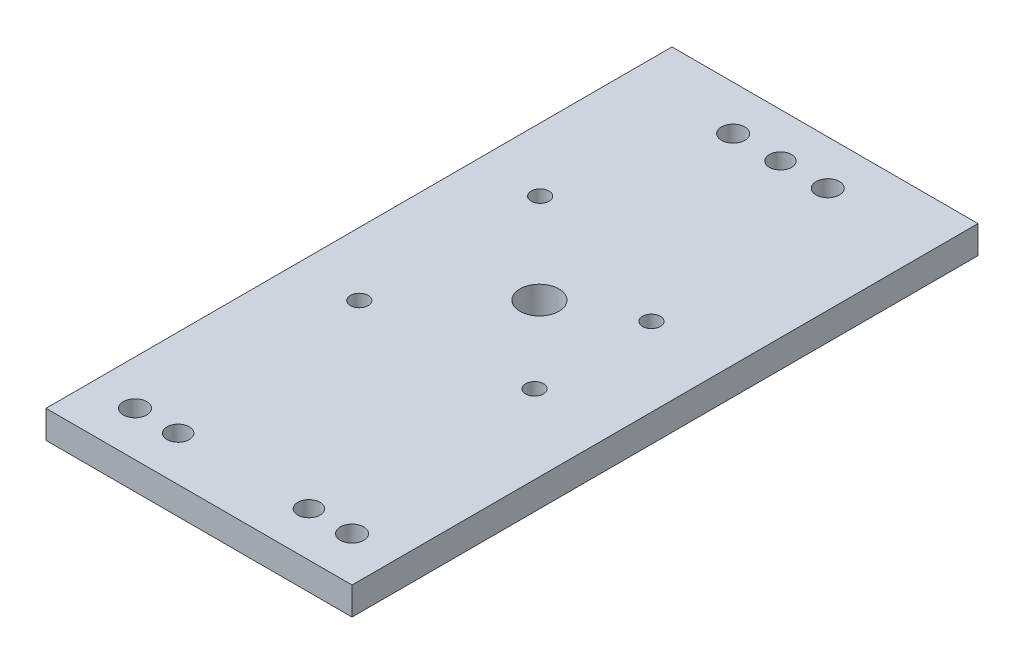
ISO-10303-21;
HEADER;
FILE_DESCRIPTION(('STEP AP214'),'2;1');
FILE_NAME('part.step','',(''),(''),'','','');
FILE_SCHEMA(('AUTOMOTIVE_DESIGN { 1 0 10303 214 1 1 1 1 }'));
ENDSEC;
DATA;
#1=APPLICATION_CONTEXT('core data for automotive mechanical design processes');
#2=APPLICATION_PROTOCOL_DEFINITION('international standard','automotive_design',2000,#1);
#3=PRODUCT_CONTEXT('',#1,'mechanical');
#4=PRODUCT('Part','Part','',(#3));
#5=PRODUCT_RELATED_PRODUCT_CATEGORY('part','',(#4));
#6=PRODUCT_DEFINITION_FORMATION('','',#4);
#7=PRODUCT_DEFINITION_CONTEXT('part definition',#1,'design');
#8=PRODUCT_DEFINITION('design','',#6,#7);
#9=PRODUCT_DEFINITION_SHAPE('','',#8);
#10=(LENGTH_UNIT() NAMED_UNIT(*) SI_UNIT(.MILLI.,.METRE.));
#11=(NAMED_UNIT(*) PLANE_ANGLE_UNIT() SI_UNIT($,.RADIAN.));
#12=(NAMED_UNIT(*) SI_UNIT($,.STERADIAN.) SOLID_ANGLE_UNIT());
#13=UNCERTAINTY_MEASURE_WITH_UNIT(LENGTH_MEASURE(1.E-05),#10,'distance_accuracy_value','');
#14=(GEOMETRIC_REPRESENTATION_CONTEXT(3) GLOBAL_UNCERTAINTY_ASSIGNED_CONTEXT((#13)) GLOBAL_UNIT_ASSIGNED_CONTEXT((#10,
#11,#12)) REPRESENTATION_CONTEXT('',''));
#15=CARTESIAN_POINT('',(0.,0.,0.));
#16=DIRECTION('',(0.,0.,1.));
#17=DIRECTION('',(1.,0.,0.));
#18=AXIS2_PLACEMENT_3D('',#15,#16,#17);
#19=CARTESIAN_POINT('',(0.,0.,0.));
#20=DIRECTION('',(0.,-1.,0.));
#21=DIRECTION('',(0.,0.,-1.));
#22=AXIS2_PLACEMENT_3D('',#19,#20,#21);
#23=PLANE('',#22);
#24=CARTESIAN_POINT('',(26.7499999999997,0.,-23.3599999999999));
#25=DIRECTION('',(0.,1.,0.));
#26=DIRECTION('',(0.,0.,1.));
#27=AXIS2_PLACEMENT_3D('',#24,#25,#26);
#28=CIRCLE('',#27,3.2);
#29=CARTESIAN_POINT('',(26.7499999999997,0.,-20.1599999999999));
#30=VERTEX_POINT('',#29);
#31=EDGE_CURVE('E192',#30,#30,#28,.T.);
#32=ORIENTED_EDGE('',*,*,#31,.F.);
#33=EDGE_LOOP('',(#32));
#34=FACE_BOUND('',#33,.T.);
#35=CARTESIAN_POINT('',(-32.2500000000002,0.,-42.3599999999969));
#36=DIRECTION('',(0.,1.,0.));
#37=DIRECTION('',(0.,0.,1.));
#38=AXIS2_PLACEMENT_3D('',#35,#36,#37);
#39=CIRCLE('',#38,3.2);
#40=CARTESIAN_POINT('',(-32.2500000000002,0.,-39.1599999999969));
#41=VERTEX_POINT('',#40);
#42=EDGE_CURVE('E202',#41,#41,#39,.T.);
#43=ORIENTED_EDGE('',*,*,#42,.F.);
#44=EDGE_LOOP('',(#43));
#45=FACE_BOUND('',#44,.T.);
#46=CARTESIAN_POINT('',(-32.2500000000002,0.,22.6400000000031));
#47=DIRECTION('',(0.,1.,0.));
#48=DIRECTION('',(0.,0.,1.));
#49=AXIS2_PLACEMENT_3D('',#46,#47,#48);
#50=CIRCLE('',#49,3.2);
#51=CARTESIAN_POINT('',(-32.2500000000002,0.,25.8400000000031));
#52=VERTEX_POINT('',#51);
#53=EDGE_CURVE('E208',#52,#52,#50,.T.);
#54=ORIENTED_EDGE('',*,*,#53,.F.);
#55=EDGE_LOOP('',(#54));
#56=FACE_BOUND('',#55,.T.);
#57=CARTESIAN_POINT('',(-1.11022302462516E-13,0.,-9.85999999999726));
#58=DIRECTION('',(0.,1.,0.));
#59=DIRECTION('',(0.,0.,1.));
#60=AXIS2_PLACEMENT_3D('',#57,#58,#59);
#61=CIRCLE('',#60,7.);
#62=CARTESIAN_POINT('',(-1.11022302462516E-13,0.,-2.85999999999726));
#63=VERTEX_POINT('',#62);
#64=EDGE_CURVE('E215',#63,#63,#61,.T.);
#65=ORIENTED_EDGE('',*,*,#64,.F.);
#66=EDGE_LOOP('',(#65));
#67=FACE_BOUND('',#66,.T.);
#68=CARTESIAN_POINT('',(0.,0.,-96.5));
#69=DIRECTION('',(0.,1.,0.));
#70=DIRECTION('',(0.,0.,1.));
#71=AXIS2_PLACEMENT_3D('',#68,#69,#70);
#72=CIRCLE('',#71,4.);
#73=CARTESIAN_POINT('',(0.,0.,-92.5));
#74=VERTEX_POINT('',#73);
#75=EDGE_CURVE('E218',#74,#74,#72,.T.);
#76=ORIENTED_EDGE('',*,*,#75,.F.);
#77=EDGE_LOOP('',(#76));
#78=FACE_BOUND('',#77,.T.);
#79=CARTESIAN_POINT('',(-23.5000000000001,0.,96.5));
#80=DIRECTION('',(0.,1.,0.));
#81=DIRECTION('',(0.,0.,1.));
#82=AXIS2_PLACEMENT_3D('',#79,#80,#81);
#83=CIRCLE('',#82,4.);
#84=CARTESIAN_POINT('',(-23.5000000000001,0.,100.5));
#85=VERTEX_POINT('',#84);
#86=EDGE_CURVE('E226',#85,#85,#83,.T.);
#87=ORIENTED_EDGE('',*,*,#86,.F.);
#88=EDGE_LOOP('',(#87));
#89=FACE_BOUND('',#88,.T.);
#90=CARTESIAN_POINT('',(23.4999999999999,0.,96.5));
#91=DIRECTION('',(0.,1.,0.));
#92=DIRECTION('',(0.,0.,1.));
#93=AXIS2_PLACEMENT_3D('',#90,#91,#92);
#94=CIRCLE('',#93,4.);
#95=CARTESIAN_POINT('',(23.4999999999999,0.,100.5));
#96=VERTEX_POINT('',#95);
#97=EDGE_CURVE('E232',#96,#96,#94,.T.);
#98=ORIENTED_EDGE('',*,*,#97,.F.);
#99=EDGE_LOOP('',(#98));
#100=FACE_BOUND('',#99,.T.);
#101=CARTESIAN_POINT('',(-17.0000000000001,0.,-96.5));
#102=DIRECTION('',(0.,1.,0.));
#103=DIRECTION('',(0.,0.,1.));
#104=AXIS2_PLACEMENT_3D('',#101,#102,#103);
#105=CIRCLE('',#104,4.2);
#106=CARTESIAN_POINT('',(-17.0000000000001,0.,-92.3));
#107=VERTEX_POINT('',#106);
#108=EDGE_CURVE('E238',#107,#107,#105,.T.);
#109=ORIENTED_EDGE('',*,*,#108,.F.);
#110=EDGE_LOOP('',(#109));
#111=FACE_BOUND('',#110,.T.);
#112=CARTESIAN_POINT('',(16.9999999999999,0.,-96.5));
#113=DIRECTION('',(0.,1.,0.));
#114=DIRECTION('',(0.,0.,1.));
#115=AXIS2_PLACEMENT_3D('',#112,#113,#114);
#116=CIRCLE('',#115,4.2);
#117=CARTESIAN_POINT('',(16.9999999999999,0.,-92.3));
#118=VERTEX_POINT('',#117);
#119=EDGE_CURVE('E244',#118,#118,#116,.T.);
#120=ORIENTED_EDGE('',*,*,#119,.F.);
#121=EDGE_LOOP('',(#120));
#122=FACE_BOUND('',#121,.T.);
#123=CARTESIAN_POINT('',(-39.0000000000001,0.,96.5));
#124=DIRECTION('',(0.,1.,0.));
#125=DIRECTION('',(0.,0.,1.));
#126=AXIS2_PLACEMENT_3D('',#123,#124,#125);
#127=CIRCLE('',#126,4.2);
#128=CARTESIAN_POINT('',(-39.0000000000001,0.,100.7));
#129=VERTEX_POINT('',#128);
#130=EDGE_CURVE('E250',#129,#129,#127,.T.);
#131=ORIENTED_EDGE('',*,*,#130,.F.);
#132=EDGE_LOOP('',(#131));
#133=FACE_BOUND('',#132,.T.);
#134=CARTESIAN_POINT('',(38.9999999999999,0.,96.5));
#135=DIRECTION('',(0.,1.,0.));
#136=DIRECTION('',(0.,0.,1.));
#137=AXIS2_PLACEMENT_3D('',#134,#135,#136);
#138=CIRCLE('',#137,4.2);
#139=CARTESIAN_POINT('',(38.9999999999999,0.,100.7));
#140=VERTEX_POINT('',#139);
#141=EDGE_CURVE('E256',#140,#140,#138,.T.);
#142=ORIENTED_EDGE('',*,*,#141,.F.);
#143=EDGE_LOOP('',(#142));
#144=FACE_BOUND('',#143,.T.);
#145=DIRECTION('',(0.,0.,-1.));
#146=VECTOR('',#145,1.);
#147=CARTESIAN_POINT('',(55.,0.,112.5));
#148=LINE('',#147,#146);
#149=CARTESIAN_POINT('',(55.,0.,112.5));
#150=VERTEX_POINT('',#149);
#151=CARTESIAN_POINT('',(55.,0.,-112.5));
#152=VERTEX_POINT('',#151);
#153=EDGE_CURVE('E108',#150,#152,#148,.T.);
#154=ORIENTED_EDGE('',*,*,#153,.T.);
#155=DIRECTION('',(-1.,0.,0.));
#156=VECTOR('',#155,1.);
#157=CARTESIAN_POINT('',(-55.,0.,-112.5));
#158=LINE('',#157,#156);
#159=CARTESIAN_POINT('',(-55.,0.,-112.5));
#160=VERTEX_POINT('',#159);
#161=EDGE_CURVE('E111',#152,#160,#158,.T.);
#162=ORIENTED_EDGE('',*,*,#161,.T.);
#163=DIRECTION('',(0.,0.,1.));
#164=VECTOR('',#163,1.);
#165=CARTESIAN_POINT('',(-55.,0.,112.5));
#166=LINE('',#165,#164);
#167=CARTESIAN_POINT('',(-55.,0.,112.5));
#168=VERTEX_POINT('',#167);
#169=EDGE_CURVE('E92',#160,#168,#166,.T.);
#170=ORIENTED_EDGE('',*,*,#169,.T.);
#171=DIRECTION('',(1.,0.,0.));
#172=VECTOR('',#171,1.);
#173=CARTESIAN_POINT('',(-55.,0.,112.5));
#174=LINE('',#173,#172);
#175=EDGE_CURVE('E103',#168,#150,#174,.T.);
#176=ORIENTED_EDGE('',*,*,#175,.T.);
#177=EDGE_LOOP('',(#154,#162,#170,#176));
#178=FACE_BOUND('',#177,.T.);
#179=CARTESIAN_POINT('',(26.7499999999997,0.,18.6400000000001));
#180=DIRECTION('',(0.,1.,0.));
#181=DIRECTION('',(0.,0.,1.));
#182=AXIS2_PLACEMENT_3D('',#179,#180,#181);
#183=CIRCLE('',#182,3.2);
#184=CARTESIAN_POINT('',(26.7499999999997,0.,21.8400000000001));
#185=VERTEX_POINT('',#184);
#186=EDGE_CURVE('E194',#185,#185,#183,.T.);
#187=ORIENTED_EDGE('',*,*,#186,.F.);
#188=EDGE_LOOP('',(#187));
#189=FACE_BOUND('',#188,.T.);
#190=ADVANCED_FACE('F41',(#34,#45,#56,#67,#78,#89,#100,#111,#122,#133,#144,#178,#189),#23,.F.);
#191=CARTESIAN_POINT('',(0.,-10.,0.));
#192=DIRECTION('',(0.,-1.,0.));
#193=DIRECTION('',(0.,0.,-1.));
#194=AXIS2_PLACEMENT_3D('',#191,#192,#193);
#195=PLANE('',#194);
#196=CARTESIAN_POINT('',(26.7499999999997,-10.,-23.3599999999999));
#197=DIRECTION('',(0.,1.,0.));
#198=DIRECTION('',(0.,0.,1.));
#199=AXIS2_PLACEMENT_3D('',#196,#197,#198);
#200=CIRCLE('',#199,3.2);
#201=CARTESIAN_POINT('',(26.7499999999997,-10.,-20.1599999999999));
#202=VERTEX_POINT('',#201);
#203=EDGE_CURVE('E190',#202,#202,#200,.T.);
#204=ORIENTED_EDGE('',*,*,#203,.T.);
#205=EDGE_LOOP('',(#204));
#206=FACE_BOUND('',#205,.T.);
#207=CARTESIAN_POINT('',(26.7499999999997,-10.,18.6400000000001));
#208=DIRECTION('',(0.,1.,0.));
#209=DIRECTION('',(0.,0.,1.));
#210=AXIS2_PLACEMENT_3D('',#207,#208,#209);
#211=CIRCLE('',#210,3.2);
#212=CARTESIAN_POINT('',(26.7499999999997,-10.,21.8400000000001));
#213=VERTEX_POINT('',#212);
#214=EDGE_CURVE('E199',#213,#213,#211,.T.);
#215=ORIENTED_EDGE('',*,*,#214,.T.);
#216=EDGE_LOOP('',(#215));
#217=FACE_BOUND('',#216,.T.);
#218=CARTESIAN_POINT('',(-32.2500000000002,-10.,-42.3599999999969));
#219=DIRECTION('',(0.,1.,0.));
#220=DIRECTION('',(0.,0.,1.));
#221=AXIS2_PLACEMENT_3D('',#218,#219,#220);
#222=CIRCLE('',#221,3.2);
#223=CARTESIAN_POINT('',(-32.2500000000002,-10.,-39.1599999999969));
#224=VERTEX_POINT('',#223);
#225=EDGE_CURVE('E205',#224,#224,#222,.T.);
#226=ORIENTED_EDGE('',*,*,#225,.T.);
#227=EDGE_LOOP('',(#226));
#228=FACE_BOUND('',#227,.T.);
#229=CARTESIAN_POINT('',(-32.2500000000002,-10.,22.6400000000031));
#230=DIRECTION('',(0.,1.,0.));
#231=DIRECTION('',(0.,0.,1.));
#232=AXIS2_PLACEMENT_3D('',#229,#230,#231);
#233=CIRCLE('',#232,3.2);
#234=CARTESIAN_POINT('',(-32.2500000000002,-10.,25.8400000000031));
#235=VERTEX_POINT('',#234);
#236=EDGE_CURVE('E211',#235,#235,#233,.T.);
#237=ORIENTED_EDGE('',*,*,#236,.T.);
#238=EDGE_LOOP('',(#237));
#239=FACE_BOUND('',#238,.T.);
#240=CARTESIAN_POINT('',(-1.11022302462516E-13,-10.,-9.85999999999726));
#241=DIRECTION('',(0.,-1.,0.));
#242=DIRECTION('',(0.,0.,-1.));
#243=AXIS2_PLACEMENT_3D('',#240,#241,#242);
#244=CIRCLE('',#243,7.);
#245=CARTESIAN_POINT('',(-1.11022302462516E-13,-10.,-16.8599999999973));
#246=VERTEX_POINT('',#245);
#247=EDGE_CURVE('E214',#246,#246,#244,.F.);
#248=ORIENTED_EDGE('',*,*,#247,.T.);
#249=EDGE_LOOP('',(#248));
#250=FACE_BOUND('',#249,.T.);
#251=CARTESIAN_POINT('',(0.,-10.,-96.5));
#252=DIRECTION('',(0.,1.,0.));
#253=DIRECTION('',(0.,0.,1.));
#254=AXIS2_PLACEMENT_3D('',#251,#252,#253);
#255=CIRCLE('',#254,4.);
#256=CARTESIAN_POINT('',(0.,-10.,-92.5));
#257=VERTEX_POINT('',#256);
#258=EDGE_CURVE('E223',#257,#257,#255,.T.);
#259=ORIENTED_EDGE('',*,*,#258,.T.);
#260=EDGE_LOOP('',(#259));
#261=FACE_BOUND('',#260,.T.);
#262=CARTESIAN_POINT('',(-23.5000000000001,-10.,96.5));
#263=DIRECTION('',(0.,1.,0.));
#264=DIRECTION('',(0.,0.,1.));
#265=AXIS2_PLACEMENT_3D('',#262,#263,#264);
#266=CIRCLE('',#265,4.);
#267=CARTESIAN_POINT('',(-23.5000000000001,-10.,100.5));
#268=VERTEX_POINT('',#267);
#269=EDGE_CURVE('E229',#268,#268,#266,.T.);
#270=ORIENTED_EDGE('',*,*,#269,.T.);
#271=EDGE_LOOP('',(#270));
#272=FACE_BOUND('',#271,.T.);
#273=CARTESIAN_POINT('',(23.4999999999999,-10.,96.5));
#274=DIRECTION('',(0.,1.,0.));
#275=DIRECTION('',(0.,0.,1.));
#276=AXIS2_PLACEMENT_3D('',#273,#274,#275);
#277=CIRCLE('',#276,4.);
#278=CARTESIAN_POINT('',(23.4999999999999,-10.,100.5));
#279=VERTEX_POINT('',#278);
#280=EDGE_CURVE('E235',#279,#279,#277,.T.);
#281=ORIENTED_EDGE('',*,*,#280,.T.);
#282=EDGE_LOOP('',(#281));
#283=FACE_BOUND('',#282,.T.);
#284=CARTESIAN_POINT('',(-17.0000000000001,-10.,-96.5));
#285=DIRECTION('',(0.,1.,0.));
#286=DIRECTION('',(0.,0.,1.));
#287=AXIS2_PLACEMENT_3D('',#284,#285,#286);
#288=CIRCLE('',#287,4.2);
#289=CARTESIAN_POINT('',(-17.0000000000001,-10.,-92.3));
#290=VERTEX_POINT('',#289);
#291=EDGE_CURVE('E241',#290,#290,#288,.T.);
#292=ORIENTED_EDGE('',*,*,#291,.T.);
#293=EDGE_LOOP('',(#292));
#294=FACE_BOUND('',#293,.T.);
#295=CARTESIAN_POINT('',(16.9999999999999,-10.,-96.5));
#296=DIRECTION('',(0.,1.,0.));
#297=DIRECTION('',(0.,0.,1.));
#298=AXIS2_PLACEMENT_3D('',#295,#296,#297);
#299=CIRCLE('',#298,4.2);
#300=CARTESIAN_POINT('',(16.9999999999999,-10.,-92.3));
#301=VERTEX_POINT('',#300);
#302=EDGE_CURVE('E247',#301,#301,#299,.T.);
#303=ORIENTED_EDGE('',*,*,#302,.T.);
#304=EDGE_LOOP('',(#303));
#305=FACE_BOUND('',#304,.T.);
#306=CARTESIAN_POINT('',(-39.0000000000001,-10.,96.5));
#307=DIRECTION('',(0.,1.,0.));
#308=DIRECTION('',(0.,0.,1.));
#309=AXIS2_PLACEMENT_3D('',#306,#307,#308);
#310=CIRCLE('',#309,4.2);
#311=CARTESIAN_POINT('',(-39.0000000000001,-10.,100.7));
#312=VERTEX_POINT('',#311);
#313=EDGE_CURVE('E253',#312,#312,#310,.T.);
#314=ORIENTED_EDGE('',*,*,#313,.T.);
#315=EDGE_LOOP('',(#314));
#316=FACE_BOUND('',#315,.T.);
#317=DIRECTION('',(0.,0.,-1.));
#318=VECTOR('',#317,1.);
#319=CARTESIAN_POINT('',(55.,-10.,112.5));
#320=LINE('',#319,#318);
#321=CARTESIAN_POINT('',(55.,-10.,112.5));
#322=VERTEX_POINT('',#321);
#323=CARTESIAN_POINT('',(55.,-10.,-112.5));
#324=VERTEX_POINT('',#323);
#325=EDGE_CURVE('E101',#322,#324,#320,.T.);
#326=ORIENTED_EDGE('',*,*,#325,.F.);
#327=DIRECTION('',(1.,0.,0.));
#328=VECTOR('',#327,1.);
#329=CARTESIAN_POINT('',(-55.,-10.,112.5));
#330=LINE('',#329,#328);
#331=CARTESIAN_POINT('',(-55.,-10.,112.5));
#332=VERTEX_POINT('',#331);
#333=EDGE_CURVE('E98',#332,#322,#330,.T.);
#334=ORIENTED_EDGE('',*,*,#333,.F.);
#335=DIRECTION('',(0.,0.,1.));
#336=VECTOR('',#335,1.);
#337=CARTESIAN_POINT('',(-55.,-10.,112.5));
#338=LINE('',#337,#336);
#339=CARTESIAN_POINT('',(-55.,-10.,-112.5));
#340=VERTEX_POINT('',#339);
#341=EDGE_CURVE('E90',#340,#332,#338,.T.);
#342=ORIENTED_EDGE('',*,*,#341,.F.);
#343=DIRECTION('',(-1.,0.,0.));
#344=VECTOR('',#343,1.);
#345=CARTESIAN_POINT('',(-55.,-10.,-112.5));
#346=LINE('',#345,#344);
#347=EDGE_CURVE('E97',#324,#340,#346,.T.);
#348=ORIENTED_EDGE('',*,*,#347,.F.);
#349=EDGE_LOOP('',(#326,#334,#342,#348));
#350=FACE_BOUND('',#349,.T.);
#351=CARTESIAN_POINT('',(38.9999999999999,-10.,96.5));
#352=DIRECTION('',(0.,1.,0.));
#353=DIRECTION('',(0.,0.,1.));
#354=AXIS2_PLACEMENT_3D('',#351,#352,#353);
#355=CIRCLE('',#354,4.2);
#356=CARTESIAN_POINT('',(38.9999999999999,-10.,100.7));
#357=VERTEX_POINT('',#356);
#358=EDGE_CURVE('E112',#357,#357,#355,.T.);
#359=ORIENTED_EDGE('',*,*,#358,.T.);
#360=EDGE_LOOP('',(#359));
#361=FACE_BOUND('',#360,.T.);
#362=ADVANCED_FACE('F95',(#206,#217,#228,#239,#250,#261,#272,#283,#294,#305,#316,#350,#361),
#195,.T.);
#363=CARTESIAN_POINT('',(55.,-10.,112.5));
#364=DIRECTION('',(1.,0.,0.));
#365=DIRECTION('',(0.,0.,-1.));
#366=AXIS2_PLACEMENT_3D('',#363,#364,#365);
#367=PLANE('',#366);
#368=ORIENTED_EDGE('',*,*,#153,.F.);
#369=DIRECTION('',(0.,1.,0.));
#370=VECTOR('',#369,1.);
#371=CARTESIAN_POINT('',(55.,-10.,112.5));
#372=LINE('',#371,#370);
#373=EDGE_CURVE('E11',#322,#150,#372,.T.);
#374=ORIENTED_EDGE('',*,*,#373,.F.);
#375=ORIENTED_EDGE('',*,*,#325,.T.);
#376=DIRECTION('',(0.,1.,0.));
#377=VECTOR('',#376,1.);
#378=CARTESIAN_POINT('',(55.,-10.,-112.5));
#379=LINE('',#378,#377);
#380=EDGE_CURVE('E45',#324,#152,#379,.T.);
#381=ORIENTED_EDGE('',*,*,#380,.T.);
#382=EDGE_LOOP('',(#368,#374,#375,#381));
#383=FACE_BOUND('',#382,.T.);
#384=ADVANCED_FACE('F43',(#383),#367,.T.);
#385=CARTESIAN_POINT('',(-55.,-10.,112.5));
#386=DIRECTION('',(0.,0.,1.));
#387=DIRECTION('',(1.,0.,0.));
#388=AXIS2_PLACEMENT_3D('',#385,#386,#387);
#389=PLANE('',#388);
#390=ORIENTED_EDGE('',*,*,#175,.F.);
#391=DIRECTION('',(0.,1.,0.));
#392=VECTOR('',#391,1.);
#393=CARTESIAN_POINT('',(-55.,-10.,112.5));
#394=LINE('',#393,#392);
#395=EDGE_CURVE('E51',#332,#168,#394,.T.);
#396=ORIENTED_EDGE('',*,*,#395,.F.);
#397=ORIENTED_EDGE('',*,*,#333,.T.);
#398=ORIENTED_EDGE('',*,*,#373,.T.);
#399=EDGE_LOOP('',(#390,#396,#397,#398));
#400=FACE_BOUND('',#399,.T.);
#401=ADVANCED_FACE('F119',(#400),#389,.T.);
#402=CARTESIAN_POINT('',(-55.,-10.,112.5));
#403=DIRECTION('',(-1.,0.,0.));
#404=DIRECTION('',(0.,0.,1.));
#405=AXIS2_PLACEMENT_3D('',#402,#403,#404);
#406=PLANE('',#405);
#407=ORIENTED_EDGE('',*,*,#169,.F.);
#408=DIRECTION('',(0.,1.,0.));
#409=VECTOR('',#408,1.);
#410=CARTESIAN_POINT('',(-55.,-10.,-112.5));
#411=LINE('',#410,#409);
#412=EDGE_CURVE('E87',#340,#160,#411,.T.);
#413=ORIENTED_EDGE('',*,*,#412,.F.);
#414=ORIENTED_EDGE('',*,*,#341,.T.);
#415=ORIENTED_EDGE('',*,*,#395,.T.);
#416=EDGE_LOOP('',(#407,#413,#414,#415));
#417=FACE_BOUND('',#416,.T.);
#418=ADVANCED_FACE('F89',(#417),#406,.T.);
#419=CARTESIAN_POINT('',(-55.,-10.,-112.5));
#420=DIRECTION('',(0.,0.,-1.));
#421=DIRECTION('',(-1.,0.,0.));
#422=AXIS2_PLACEMENT_3D('',#419,#420,#421);
#423=PLANE('',#422);
#424=ORIENTED_EDGE('',*,*,#161,.F.);
#425=ORIENTED_EDGE('',*,*,#380,.F.);
#426=ORIENTED_EDGE('',*,*,#347,.T.);
#427=ORIENTED_EDGE('',*,*,#412,.T.);
#428=EDGE_LOOP('',(#424,#425,#426,#427));
#429=FACE_BOUND('',#428,.T.);
#430=ADVANCED_FACE('F100',(#429),#423,.T.);
#431=CARTESIAN_POINT('',(38.9999999999999,0.,96.5));
#432=DIRECTION('',(0.,1.,0.));
#433=DIRECTION('',(0.,0.,1.));
#434=AXIS2_PLACEMENT_3D('',#431,#432,#433);
#435=CYLINDRICAL_SURFACE('',#434,4.2);
#436=ORIENTED_EDGE('',*,*,#358,.F.);
#437=EDGE_LOOP('',(#436));
#438=FACE_BOUND('',#437,.T.);
#439=ORIENTED_EDGE('',*,*,#141,.T.);
#440=EDGE_LOOP('',(#439));
#441=FACE_BOUND('',#440,.T.);
#442=ADVANCED_FACE('F139',(#438,#441),#435,.F.);
#443=CARTESIAN_POINT('',(-39.0000000000001,0.,96.5));
#444=DIRECTION('',(0.,1.,0.));
#445=DIRECTION('',(0.,0.,1.));
#446=AXIS2_PLACEMENT_3D('',#443,#444,#445);
#447=CYLINDRICAL_SURFACE('',#446,4.2);
#448=ORIENTED_EDGE('',*,*,#313,.F.);
#449=EDGE_LOOP('',(#448));
#450=FACE_BOUND('',#449,.T.);
#451=ORIENTED_EDGE('',*,*,#130,.T.);
#452=EDGE_LOOP('',(#451));
#453=FACE_BOUND('',#452,.T.);
#454=ADVANCED_FACE('F142',(#450,#453),#447,.F.);
#455=CARTESIAN_POINT('',(16.9999999999999,0.,-96.5));
#456=DIRECTION('',(0.,1.,0.));
#457=DIRECTION('',(0.,0.,1.));
#458=AXIS2_PLACEMENT_3D('',#455,#456,#457);
#459=CYLINDRICAL_SURFACE('',#458,4.2);
#460=ORIENTED_EDGE('',*,*,#302,.F.);
#461=EDGE_LOOP('',(#460));
#462=FACE_BOUND('',#461,.T.);
#463=ORIENTED_EDGE('',*,*,#119,.T.);
#464=EDGE_LOOP('',(#463));
#465=FACE_BOUND('',#464,.T.);
#466=ADVANCED_FACE('F146',(#462,#465),#459,.F.);
#467=CARTESIAN_POINT('',(-17.0000000000001,0.,-96.5));
#468=DIRECTION('',(0.,1.,0.));
#469=DIRECTION('',(0.,0.,1.));
#470=AXIS2_PLACEMENT_3D('',#467,#468,#469);
#471=CYLINDRICAL_SURFACE('',#470,4.2);
#472=ORIENTED_EDGE('',*,*,#291,.F.);
#473=EDGE_LOOP('',(#472));
#474=FACE_BOUND('',#473,.T.);
#475=ORIENTED_EDGE('',*,*,#108,.T.);
#476=EDGE_LOOP('',(#475));
#477=FACE_BOUND('',#476,.T.);
#478=ADVANCED_FACE('F150',(#474,#477),#471,.F.);
#479=CARTESIAN_POINT('',(23.4999999999999,0.,96.5));
#480=DIRECTION('',(0.,1.,0.));
#481=DIRECTION('',(0.,0.,1.));
#482=AXIS2_PLACEMENT_3D('',#479,#480,#481);
#483=CYLINDRICAL_SURFACE('',#482,4.);
#484=ORIENTED_EDGE('',*,*,#280,.F.);
#485=EDGE_LOOP('',(#484));
#486=FACE_BOUND('',#485,.T.);
#487=ORIENTED_EDGE('',*,*,#97,.T.);
#488=EDGE_LOOP('',(#487));
#489=FACE_BOUND('',#488,.T.);
#490=ADVANCED_FACE('F154',(#486,#489),#483,.F.);
#491=CARTESIAN_POINT('',(-23.5000000000001,0.,96.5));
#492=DIRECTION('',(0.,1.,0.));
#493=DIRECTION('',(0.,0.,1.));
#494=AXIS2_PLACEMENT_3D('',#491,#492,#493);
#495=CYLINDRICAL_SURFACE('',#494,4.);
#496=ORIENTED_EDGE('',*,*,#269,.F.);
#497=EDGE_LOOP('',(#496));
#498=FACE_BOUND('',#497,.T.);
#499=ORIENTED_EDGE('',*,*,#86,.T.);
#500=EDGE_LOOP('',(#499));
#501=FACE_BOUND('',#500,.T.);
#502=ADVANCED_FACE('F158',(#498,#501),#495,.F.);
#503=CARTESIAN_POINT('',(0.,0.,-96.5));
#504=DIRECTION('',(0.,1.,0.));
#505=DIRECTION('',(0.,0.,1.));
#506=AXIS2_PLACEMENT_3D('',#503,#504,#505);
#507=CYLINDRICAL_SURFACE('',#506,4.);
#508=ORIENTED_EDGE('',*,*,#258,.F.);
#509=EDGE_LOOP('',(#508));
#510=FACE_BOUND('',#509,.T.);
#511=ORIENTED_EDGE('',*,*,#75,.T.);
#512=EDGE_LOOP('',(#511));
#513=FACE_BOUND('',#512,.T.);
#514=ADVANCED_FACE('F162',(#510,#513),#507,.F.);
#515=CARTESIAN_POINT('',(-1.11022302462516E-13,-10.001,-9.85999999999726));
#516=DIRECTION('',(0.,1.,0.));
#517=DIRECTION('',(0.,0.,1.));
#518=AXIS2_PLACEMENT_3D('',#515,#516,#517);
#519=CYLINDRICAL_SURFACE('',#518,7.);
#520=ORIENTED_EDGE('',*,*,#247,.F.);
#521=EDGE_LOOP('',(#520));
#522=FACE_BOUND('',#521,.T.);
#523=ORIENTED_EDGE('',*,*,#64,.T.);
#524=EDGE_LOOP('',(#523));
#525=FACE_BOUND('',#524,.T.);
#526=ADVANCED_FACE('F166',(#522,#525),#519,.F.);
#527=CARTESIAN_POINT('',(-32.2500000000002,0.,22.6400000000031));
#528=DIRECTION('',(0.,1.,0.));
#529=DIRECTION('',(0.,0.,1.));
#530=AXIS2_PLACEMENT_3D('',#527,#528,#529);
#531=CYLINDRICAL_SURFACE('',#530,3.2);
#532=ORIENTED_EDGE('',*,*,#236,.F.);
#533=EDGE_LOOP('',(#532));
#534=FACE_BOUND('',#533,.T.);
#535=ORIENTED_EDGE('',*,*,#53,.T.);
#536=EDGE_LOOP('',(#535));
#537=FACE_BOUND('',#536,.T.);
#538=ADVANCED_FACE('F169',(#534,#537),#531,.F.);
#539=CARTESIAN_POINT('',(-32.2500000000002,0.,-42.3599999999969));
#540=DIRECTION('',(0.,1.,0.));
#541=DIRECTION('',(0.,0.,1.));
#542=AXIS2_PLACEMENT_3D('',#539,#540,#541);
#543=CYLINDRICAL_SURFACE('',#542,3.2);
#544=ORIENTED_EDGE('',*,*,#225,.F.);
#545=EDGE_LOOP('',(#544));
#546=FACE_BOUND('',#545,.T.);
#547=ORIENTED_EDGE('',*,*,#42,.T.);
#548=EDGE_LOOP('',(#547));
#549=FACE_BOUND('',#548,.T.);
#550=ADVANCED_FACE('F173',(#546,#549),#543,.F.);
#551=CARTESIAN_POINT('',(26.7499999999997,0.,18.6400000000001));
#552=DIRECTION('',(0.,1.,0.));
#553=DIRECTION('',(0.,0.,1.));
#554=AXIS2_PLACEMENT_3D('',#551,#552,#553);
#555=CYLINDRICAL_SURFACE('',#554,3.2);
#556=ORIENTED_EDGE('',*,*,#214,.F.);
#557=EDGE_LOOP('',(#556));
#558=FACE_BOUND('',#557,.T.);
#559=ORIENTED_EDGE('',*,*,#186,.T.);
#560=EDGE_LOOP('',(#559));
#561=FACE_BOUND('',#560,.T.);
#562=ADVANCED_FACE('F177',(#558,#561),#555,.F.);
#563=CARTESIAN_POINT('',(26.7499999999997,0.,-23.3599999999999));
#564=DIRECTION('',(0.,1.,0.));
#565=DIRECTION('',(0.,0.,1.));
#566=AXIS2_PLACEMENT_3D('',#563,#564,#565);
#567=CYLINDRICAL_SURFACE('',#566,3.2);
#568=ORIENTED_EDGE('',*,*,#203,.F.);
#569=EDGE_LOOP('',(#568));
#570=FACE_BOUND('',#569,.T.);
#571=ORIENTED_EDGE('',*,*,#31,.T.);
#572=EDGE_LOOP('',(#571));
#573=FACE_BOUND('',#572,.T.);
#574=ADVANCED_FACE('F181',(#570,#573),#567,.F.);
#575=CLOSED_SHELL('',(#190,#362,#384,#401,#418,#430,#442,#454,#466,#478,#490,#502,#514,#526,
#538,#550,#562,#574));
#576=MANIFOLD_SOLID_BREP('B2',#575);
#577=ADVANCED_BREP_SHAPE_REPRESENTATION('',(#18,#576),#14);
#578=SHAPE_DEFINITION_REPRESENTATION(#9,#577);
ENDSEC;
END-ISO-10303-21;
